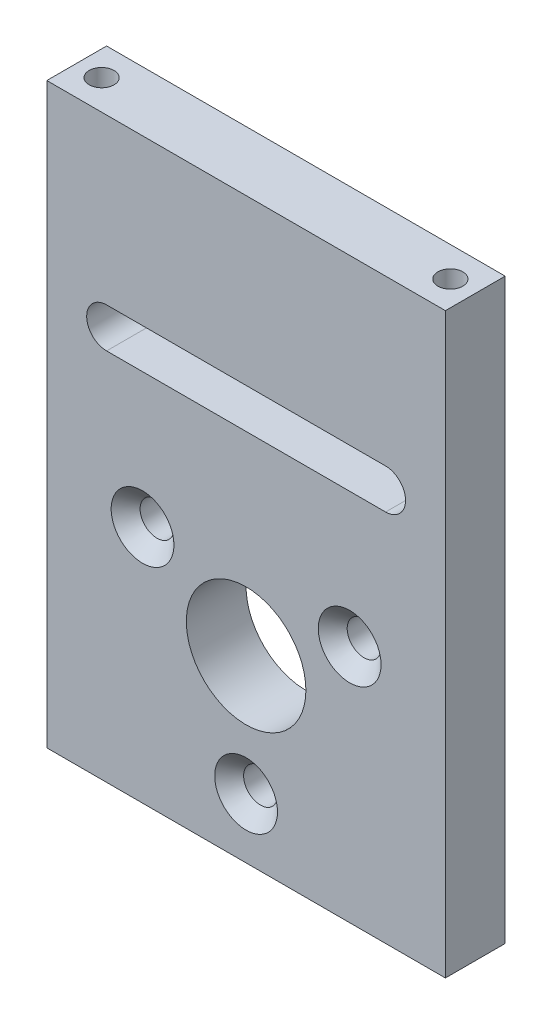
ISO-10303-21;
HEADER;
FILE_DESCRIPTION(('STEP AP214'),'2;1');
FILE_NAME('part.step','',(''),(''),'','','');
FILE_SCHEMA(('AUTOMOTIVE_DESIGN { 1 0 10303 214 1 1 1 1 }'));
ENDSEC;
DATA;
#1=APPLICATION_CONTEXT('core data for automotive mechanical design processes');
#2=APPLICATION_PROTOCOL_DEFINITION('international standard','automotive_design',2000,#1);
#3=PRODUCT_CONTEXT('',#1,'mechanical');
#4=PRODUCT('Part','Part','',(#3));
#5=PRODUCT_RELATED_PRODUCT_CATEGORY('part','',(#4));
#6=PRODUCT_DEFINITION_FORMATION('','',#4);
#7=PRODUCT_DEFINITION_CONTEXT('part definition',#1,'design');
#8=PRODUCT_DEFINITION('design','',#6,#7);
#9=PRODUCT_DEFINITION_SHAPE('','',#8);
#10=(LENGTH_UNIT() NAMED_UNIT(*) SI_UNIT(.MILLI.,.METRE.));
#11=(NAMED_UNIT(*) PLANE_ANGLE_UNIT() SI_UNIT($,.RADIAN.));
#12=(NAMED_UNIT(*) SI_UNIT($,.STERADIAN.) SOLID_ANGLE_UNIT());
#13=UNCERTAINTY_MEASURE_WITH_UNIT(LENGTH_MEASURE(1.E-05),#10,'distance_accuracy_value','');
#14=(GEOMETRIC_REPRESENTATION_CONTEXT(3) GLOBAL_UNCERTAINTY_ASSIGNED_CONTEXT((#13)) GLOBAL_UNIT_ASSIGNED_CONTEXT((#10,
#11,#12)) REPRESENTATION_CONTEXT('',''));
#15=CARTESIAN_POINT('',(0.,0.,0.));
#16=DIRECTION('',(0.,0.,1.));
#17=DIRECTION('',(1.,0.,0.));
#18=AXIS2_PLACEMENT_3D('',#15,#16,#17);
#19=CARTESIAN_POINT('',(20.,-29.,3.));
#20=DIRECTION('',(-1.,0.,0.));
#21=DIRECTION('',(0.,0.,1.));
#22=AXIS2_PLACEMENT_3D('',#19,#20,#21);
#23=PLANE('',#22);
#24=DIRECTION('',(0.,1.,0.));
#25=VECTOR('',#24,1.);
#26=CARTESIAN_POINT('',(20.,-29.,-3.));
#27=LINE('',#26,#25);
#28=CARTESIAN_POINT('',(20.,-29.,-3.));
#29=VERTEX_POINT('',#28);
#30=CARTESIAN_POINT('',(20.,29.,-3.));
#31=VERTEX_POINT('',#30);
#32=EDGE_CURVE('E243',#29,#31,#27,.T.);
#33=ORIENTED_EDGE('',*,*,#32,.T.);
#34=DIRECTION('',(0.,0.,-1.));
#35=VECTOR('',#34,1.);
#36=CARTESIAN_POINT('',(20.,29.,3.));
#37=LINE('',#36,#35);
#38=CARTESIAN_POINT('',(20.,29.,3.));
#39=VERTEX_POINT('',#38);
#40=EDGE_CURVE('E11',#39,#31,#37,.T.);
#41=ORIENTED_EDGE('',*,*,#40,.F.);
#42=DIRECTION('',(0.,1.,0.));
#43=VECTOR('',#42,1.);
#44=CARTESIAN_POINT('',(20.,-29.,3.));
#45=LINE('',#44,#43);
#46=CARTESIAN_POINT('',(20.,-29.,3.));
#47=VERTEX_POINT('',#46);
#48=EDGE_CURVE('E247',#47,#39,#45,.T.);
#49=ORIENTED_EDGE('',*,*,#48,.F.);
#50=DIRECTION('',(0.,0.,-1.));
#51=VECTOR('',#50,1.);
#52=CARTESIAN_POINT('',(20.,-29.,3.));
#53=LINE('',#52,#51);
#54=EDGE_CURVE('E261',#47,#29,#53,.T.);
#55=ORIENTED_EDGE('',*,*,#54,.T.);
#56=EDGE_LOOP('',(#33,#41,#49,#55));
#57=FACE_BOUND('',#56,.T.);
#58=ADVANCED_FACE('F44',(#57),#23,.F.);
#59=CARTESIAN_POINT('',(-20.,29.,3.));
#60=DIRECTION('',(0.,-1.,0.));
#61=DIRECTION('',(0.,0.,-1.));
#62=AXIS2_PLACEMENT_3D('',#59,#60,#61);
#63=PLANE('',#62);
#64=CARTESIAN_POINT('',(17.5,29.,0.));
#65=DIRECTION('',(0.,1.,0.));
#66=DIRECTION('',(0.,0.,1.));
#67=AXIS2_PLACEMENT_3D('',#64,#65,#66);
#68=CIRCLE('',#67,1.24999999999999);
#69=CARTESIAN_POINT('',(17.5,29.,1.24999999999999));
#70=VERTEX_POINT('',#69);
#71=EDGE_CURVE('E165',#70,#70,#68,.T.);
#72=ORIENTED_EDGE('',*,*,#71,.F.);
#73=EDGE_LOOP('',(#72));
#74=FACE_BOUND('',#73,.T.);
#75=CARTESIAN_POINT('',(-17.5,29.,0.));
#76=DIRECTION('',(0.,1.,0.));
#77=DIRECTION('',(0.,0.,1.));
#78=AXIS2_PLACEMENT_3D('',#75,#76,#77);
#79=CIRCLE('',#78,1.24999999999999);
#80=CARTESIAN_POINT('',(-17.5,29.,1.24999999999999));
#81=VERTEX_POINT('',#80);
#82=EDGE_CURVE('E178',#81,#81,#79,.T.);
#83=ORIENTED_EDGE('',*,*,#82,.F.);
#84=EDGE_LOOP('',(#83));
#85=FACE_BOUND('',#84,.T.);
#86=DIRECTION('',(-1.,0.,0.));
#87=VECTOR('',#86,1.);
#88=CARTESIAN_POINT('',(-20.,29.,-3.));
#89=LINE('',#88,#87);
#90=CARTESIAN_POINT('',(-20.,29.,-3.));
#91=VERTEX_POINT('',#90);
#92=EDGE_CURVE('E265',#31,#91,#89,.T.);
#93=ORIENTED_EDGE('',*,*,#92,.T.);
#94=DIRECTION('',(0.,0.,-1.));
#95=VECTOR('',#94,1.);
#96=CARTESIAN_POINT('',(-20.,29.,3.));
#97=LINE('',#96,#95);
#98=CARTESIAN_POINT('',(-20.,29.,3.));
#99=VERTEX_POINT('',#98);
#100=EDGE_CURVE('E52',#99,#91,#97,.T.);
#101=ORIENTED_EDGE('',*,*,#100,.F.);
#102=DIRECTION('',(-1.,0.,0.));
#103=VECTOR('',#102,1.);
#104=CARTESIAN_POINT('',(-20.,29.,3.));
#105=LINE('',#104,#103);
#106=EDGE_CURVE('E251',#39,#99,#105,.T.);
#107=ORIENTED_EDGE('',*,*,#106,.F.);
#108=ORIENTED_EDGE('',*,*,#40,.T.);
#109=EDGE_LOOP('',(#93,#101,#107,#108));
#110=FACE_BOUND('',#109,.T.);
#111=ADVANCED_FACE('F301',(#74,#85,#110),#63,.F.);
#112=CARTESIAN_POINT('',(-20.,-29.,3.));
#113=DIRECTION('',(1.,0.,0.));
#114=DIRECTION('',(0.,0.,-1.));
#115=AXIS2_PLACEMENT_3D('',#112,#113,#114);
#116=PLANE('',#115);
#117=DIRECTION('',(0.,-1.,0.));
#118=VECTOR('',#117,1.);
#119=CARTESIAN_POINT('',(-20.,-29.,-3.));
#120=LINE('',#119,#118);
#121=CARTESIAN_POINT('',(-20.,-29.,-3.));
#122=VERTEX_POINT('',#121);
#123=EDGE_CURVE('E268',#91,#122,#120,.T.);
#124=ORIENTED_EDGE('',*,*,#123,.T.);
#125=DIRECTION('',(0.,0.,-1.));
#126=VECTOR('',#125,1.);
#127=CARTESIAN_POINT('',(-20.,-29.,3.));
#128=LINE('',#127,#126);
#129=CARTESIAN_POINT('',(-20.,-29.,3.));
#130=VERTEX_POINT('',#129);
#131=EDGE_CURVE('E276',#130,#122,#128,.T.);
#132=ORIENTED_EDGE('',*,*,#131,.F.);
#133=DIRECTION('',(0.,-1.,0.));
#134=VECTOR('',#133,1.);
#135=CARTESIAN_POINT('',(-20.,-29.,3.));
#136=LINE('',#135,#134);
#137=EDGE_CURVE('E255',#99,#130,#136,.T.);
#138=ORIENTED_EDGE('',*,*,#137,.F.);
#139=ORIENTED_EDGE('',*,*,#100,.T.);
#140=EDGE_LOOP('',(#124,#132,#138,#139));
#141=FACE_BOUND('',#140,.T.);
#142=ADVANCED_FACE('F286',(#141),#116,.F.);
#143=CARTESIAN_POINT('',(-20.,-29.,3.));
#144=DIRECTION('',(0.,1.,0.));
#145=DIRECTION('',(0.,0.,1.));
#146=AXIS2_PLACEMENT_3D('',#143,#144,#145);
#147=PLANE('',#146);
#148=CARTESIAN_POINT('',(-10.75,-29.,0.));
#149=DIRECTION('',(0.,-1.,0.));
#150=DIRECTION('',(0.,0.,-1.));
#151=AXIS2_PLACEMENT_3D('',#148,#149,#150);
#152=CIRCLE('',#151,1.24999999999999);
#153=CARTESIAN_POINT('',(-10.75,-29.,-1.24999999999999));
#154=VERTEX_POINT('',#153);
#155=EDGE_CURVE('E186',#154,#154,#152,.T.);
#156=ORIENTED_EDGE('',*,*,#155,.F.);
#157=EDGE_LOOP('',(#156));
#158=FACE_BOUND('',#157,.T.);
#159=CARTESIAN_POINT('',(10.75,-29.,0.));
#160=DIRECTION('',(0.,-1.,0.));
#161=DIRECTION('',(0.,0.,-1.));
#162=AXIS2_PLACEMENT_3D('',#159,#160,#161);
#163=CIRCLE('',#162,1.24999999999999);
#164=CARTESIAN_POINT('',(10.75,-29.,-1.24999999999999));
#165=VERTEX_POINT('',#164);
#166=EDGE_CURVE('E194',#165,#165,#163,.T.);
#167=ORIENTED_EDGE('',*,*,#166,.F.);
#168=EDGE_LOOP('',(#167));
#169=FACE_BOUND('',#168,.T.);
#170=DIRECTION('',(1.,0.,0.));
#171=VECTOR('',#170,1.);
#172=CARTESIAN_POINT('',(-20.,-29.,-3.));
#173=LINE('',#172,#171);
#174=EDGE_CURVE('E252',#122,#29,#173,.T.);
#175=ORIENTED_EDGE('',*,*,#174,.T.);
#176=ORIENTED_EDGE('',*,*,#54,.F.);
#177=DIRECTION('',(1.,0.,0.));
#178=VECTOR('',#177,1.);
#179=CARTESIAN_POINT('',(-20.,-29.,3.));
#180=LINE('',#179,#178);
#181=EDGE_CURVE('E258',#130,#47,#180,.T.);
#182=ORIENTED_EDGE('',*,*,#181,.F.);
#183=ORIENTED_EDGE('',*,*,#131,.T.);
#184=EDGE_LOOP('',(#175,#176,#182,#183));
#185=FACE_BOUND('',#184,.T.);
#186=ADVANCED_FACE('F294',(#158,#169,#185),#147,.F.);
#187=CARTESIAN_POINT('',(0.,0.,3.));
#188=DIRECTION('',(0.,0.,-1.));
#189=DIRECTION('',(-1.,0.,0.));
#190=AXIS2_PLACEMENT_3D('',#187,#188,#189);
#191=PLANE('',#190);
#192=DIRECTION('',(1.,0.,0.));
#193=VECTOR('',#192,1.);
#194=CARTESIAN_POINT('',(-14.,8.5,3.));
#195=LINE('',#194,#193);
#196=CARTESIAN_POINT('',(-14.,8.5,3.));
#197=VERTEX_POINT('',#196);
#198=CARTESIAN_POINT('',(14.,8.5,3.));
#199=VERTEX_POINT('',#198);
#200=EDGE_CURVE('E156',#197,#199,#195,.T.);
#201=ORIENTED_EDGE('',*,*,#200,.F.);
#202=CARTESIAN_POINT('',(-14.,10.5,3.));
#203=DIRECTION('',(0.,0.,1.));
#204=DIRECTION('',(1.,0.,0.));
#205=AXIS2_PLACEMENT_3D('',#202,#203,#204);
#206=CIRCLE('',#205,2.);
#207=CARTESIAN_POINT('',(-14.,12.5,3.));
#208=VERTEX_POINT('',#207);
#209=EDGE_CURVE('E59',#208,#197,#206,.T.);
#210=ORIENTED_EDGE('',*,*,#209,.F.);
#211=DIRECTION('',(-1.,0.,0.));
#212=VECTOR('',#211,1.);
#213=CARTESIAN_POINT('',(-14.,12.5,3.));
#214=LINE('',#213,#212);
#215=CARTESIAN_POINT('',(14.,12.5,3.));
#216=VERTEX_POINT('',#215);
#217=EDGE_CURVE('E142',#216,#208,#214,.T.);
#218=ORIENTED_EDGE('',*,*,#217,.F.);
#219=CARTESIAN_POINT('',(14.,10.5,3.));
#220=DIRECTION('',(0.,0.,1.));
#221=DIRECTION('',(1.,0.,0.));
#222=AXIS2_PLACEMENT_3D('',#219,#220,#221);
#223=CIRCLE('',#222,2.);
#224=EDGE_CURVE('E147',#199,#216,#223,.T.);
#225=ORIENTED_EDGE('',*,*,#224,.F.);
#226=EDGE_LOOP('',(#201,#210,#218,#225));
#227=FACE_BOUND('',#226,.T.);
#228=CARTESIAN_POINT('',(0.,-23.,3.));
#229=DIRECTION('',(0.,0.,1.));
#230=DIRECTION('',(1.,0.,0.));
#231=AXIS2_PLACEMENT_3D('',#228,#229,#230);
#232=CIRCLE('',#231,3.15);
#233=CARTESIAN_POINT('',(3.15,-23.,3.));
#234=VERTEX_POINT('',#233);
#235=EDGE_CURVE('E202',#234,#234,#232,.T.);
#236=ORIENTED_EDGE('',*,*,#235,.F.);
#237=EDGE_LOOP('',(#236));
#238=FACE_BOUND('',#237,.T.);
#239=CARTESIAN_POINT('',(-10.3923048454133,-5.00000000000001,3.));
#240=DIRECTION('',(0.,0.,1.));
#241=DIRECTION('',(1.,0.,0.));
#242=AXIS2_PLACEMENT_3D('',#239,#240,#241);
#243=CIRCLE('',#242,3.15);
#244=CARTESIAN_POINT('',(-7.24230484541326,-5.00000000000001,3.));
#245=VERTEX_POINT('',#244);
#246=EDGE_CURVE('E214',#245,#245,#243,.T.);
#247=ORIENTED_EDGE('',*,*,#246,.F.);
#248=EDGE_LOOP('',(#247));
#249=FACE_BOUND('',#248,.T.);
#250=CARTESIAN_POINT('',(10.3923048454133,-5.00000000000001,3.));
#251=DIRECTION('',(0.,0.,1.));
#252=DIRECTION('',(1.,0.,0.));
#253=AXIS2_PLACEMENT_3D('',#250,#251,#252);
#254=CIRCLE('',#253,3.15);
#255=CARTESIAN_POINT('',(13.5423048454133,-5.00000000000001,3.));
#256=VERTEX_POINT('',#255);
#257=EDGE_CURVE('E226',#256,#256,#254,.T.);
#258=ORIENTED_EDGE('',*,*,#257,.F.);
#259=EDGE_LOOP('',(#258));
#260=FACE_BOUND('',#259,.T.);
#261=CARTESIAN_POINT('',(0.,-11.,3.));
#262=DIRECTION('',(0.,0.,1.));
#263=DIRECTION('',(1.,0.,0.));
#264=AXIS2_PLACEMENT_3D('',#261,#262,#263);
#265=CIRCLE('',#264,6.);
#266=CARTESIAN_POINT('',(6.,-11.,3.));
#267=VERTEX_POINT('',#266);
#268=EDGE_CURVE('E238',#267,#267,#265,.T.);
#269=ORIENTED_EDGE('',*,*,#268,.F.);
#270=EDGE_LOOP('',(#269));
#271=FACE_BOUND('',#270,.T.);
#272=ORIENTED_EDGE('',*,*,#48,.T.);
#273=ORIENTED_EDGE('',*,*,#106,.T.);
#274=ORIENTED_EDGE('',*,*,#137,.T.);
#275=ORIENTED_EDGE('',*,*,#181,.T.);
#276=EDGE_LOOP('',(#272,#273,#274,#275));
#277=FACE_BOUND('',#276,.T.);
#278=ADVANCED_FACE('F300',(#227,#238,#249,#260,#271,#277),#191,.F.);
#279=CARTESIAN_POINT('',(0.,0.,-3.));
#280=DIRECTION('',(0.,0.,-1.));
#281=DIRECTION('',(-1.,0.,0.));
#282=AXIS2_PLACEMENT_3D('',#279,#280,#281);
#283=PLANE('',#282);
#284=CARTESIAN_POINT('',(-14.,10.5,-3.));
#285=DIRECTION('',(0.,0.,1.));
#286=DIRECTION('',(1.,0.,0.));
#287=AXIS2_PLACEMENT_3D('',#284,#285,#286);
#288=CIRCLE('',#287,2.);
#289=CARTESIAN_POINT('',(-14.,12.5,-3.));
#290=VERTEX_POINT('',#289);
#291=CARTESIAN_POINT('',(-14.,8.5,-3.));
#292=VERTEX_POINT('',#291);
#293=EDGE_CURVE('E123',#290,#292,#288,.T.);
#294=ORIENTED_EDGE('',*,*,#293,.T.);
#295=DIRECTION('',(1.,0.,0.));
#296=VECTOR('',#295,1.);
#297=CARTESIAN_POINT('',(-14.,8.5,-3.));
#298=LINE('',#297,#296);
#299=CARTESIAN_POINT('',(14.,8.5,-3.));
#300=VERTEX_POINT('',#299);
#301=EDGE_CURVE('E133',#292,#300,#298,.T.);
#302=ORIENTED_EDGE('',*,*,#301,.T.);
#303=CARTESIAN_POINT('',(14.,10.5,-3.));
#304=DIRECTION('',(0.,0.,1.));
#305=DIRECTION('',(1.,0.,0.));
#306=AXIS2_PLACEMENT_3D('',#303,#304,#305);
#307=CIRCLE('',#306,2.);
#308=CARTESIAN_POINT('',(14.,12.5,-3.));
#309=VERTEX_POINT('',#308);
#310=EDGE_CURVE('E67',#300,#309,#307,.T.);
#311=ORIENTED_EDGE('',*,*,#310,.T.);
#312=DIRECTION('',(-1.,0.,0.));
#313=VECTOR('',#312,1.);
#314=CARTESIAN_POINT('',(-14.,12.5,-3.));
#315=LINE('',#314,#313);
#316=EDGE_CURVE('E130',#309,#290,#315,.T.);
#317=ORIENTED_EDGE('',*,*,#316,.T.);
#318=EDGE_LOOP('',(#294,#302,#311,#317));
#319=FACE_BOUND('',#318,.T.);
#320=CARTESIAN_POINT('',(0.,-23.,-3.));
#321=DIRECTION('',(0.,0.,1.));
#322=DIRECTION('',(1.,0.,0.));
#323=AXIS2_PLACEMENT_3D('',#320,#321,#322);
#324=CIRCLE('',#323,1.7);
#325=CARTESIAN_POINT('',(1.7,-23.,-3.));
#326=VERTEX_POINT('',#325);
#327=EDGE_CURVE('E210',#326,#326,#324,.T.);
#328=ORIENTED_EDGE('',*,*,#327,.T.);
#329=EDGE_LOOP('',(#328));
#330=FACE_BOUND('',#329,.T.);
#331=CARTESIAN_POINT('',(-10.3923048454133,-5.00000000000001,-3.));
#332=DIRECTION('',(0.,0.,1.));
#333=DIRECTION('',(1.,0.,0.));
#334=AXIS2_PLACEMENT_3D('',#331,#332,#333);
#335=CIRCLE('',#334,1.7);
#336=CARTESIAN_POINT('',(-8.69230484541326,-5.00000000000001,-3.));
#337=VERTEX_POINT('',#336);
#338=EDGE_CURVE('E222',#337,#337,#335,.T.);
#339=ORIENTED_EDGE('',*,*,#338,.T.);
#340=EDGE_LOOP('',(#339));
#341=FACE_BOUND('',#340,.T.);
#342=CARTESIAN_POINT('',(10.3923048454133,-5.00000000000001,-3.));
#343=DIRECTION('',(0.,0.,1.));
#344=DIRECTION('',(1.,0.,0.));
#345=AXIS2_PLACEMENT_3D('',#342,#343,#344);
#346=CIRCLE('',#345,1.7);
#347=CARTESIAN_POINT('',(12.0923048454133,-5.00000000000001,-3.));
#348=VERTEX_POINT('',#347);
#349=EDGE_CURVE('E234',#348,#348,#346,.T.);
#350=ORIENTED_EDGE('',*,*,#349,.T.);
#351=EDGE_LOOP('',(#350));
#352=FACE_BOUND('',#351,.T.);
#353=CARTESIAN_POINT('',(0.,-11.,-3.));
#354=DIRECTION('',(0.,0.,1.));
#355=DIRECTION('',(1.,0.,0.));
#356=AXIS2_PLACEMENT_3D('',#353,#354,#355);
#357=CIRCLE('',#356,6.);
#358=CARTESIAN_POINT('',(6.,-11.,-3.));
#359=VERTEX_POINT('',#358);
#360=EDGE_CURVE('E239',#359,#359,#357,.T.);
#361=ORIENTED_EDGE('',*,*,#360,.T.);
#362=EDGE_LOOP('',(#361));
#363=FACE_BOUND('',#362,.T.);
#364=ORIENTED_EDGE('',*,*,#32,.F.);
#365=ORIENTED_EDGE('',*,*,#174,.F.);
#366=ORIENTED_EDGE('',*,*,#123,.F.);
#367=ORIENTED_EDGE('',*,*,#92,.F.);
#368=EDGE_LOOP('',(#364,#365,#366,#367));
#369=FACE_BOUND('',#368,.T.);
#370=ADVANCED_FACE('F138',(#319,#330,#341,#352,#363,#369),#283,.T.);
#371=CARTESIAN_POINT('',(0.,-11.,-3.));
#372=DIRECTION('',(0.,0.,1.));
#373=DIRECTION('',(1.,0.,0.));
#374=AXIS2_PLACEMENT_3D('',#371,#372,#373);
#375=CYLINDRICAL_SURFACE('',#374,6.);
#376=ORIENTED_EDGE('',*,*,#360,.F.);
#377=EDGE_LOOP('',(#376));
#378=FACE_BOUND('',#377,.T.);
#379=ORIENTED_EDGE('',*,*,#268,.T.);
#380=EDGE_LOOP('',(#379));
#381=FACE_BOUND('',#380,.T.);
#382=ADVANCED_FACE('F317',(#378,#381),#375,.F.);
#383=CARTESIAN_POINT('',(10.3923048454133,-5.00000000000001,3.));
#384=DIRECTION('',(0.,0.,1.));
#385=DIRECTION('',(1.,0.,0.));
#386=AXIS2_PLACEMENT_3D('',#383,#384,#385);
#387=CYLINDRICAL_SURFACE('',#386,1.7);
#388=ORIENTED_EDGE('',*,*,#349,.F.);
#389=EDGE_LOOP('',(#388));
#390=FACE_BOUND('',#389,.T.);
#391=CARTESIAN_POINT('',(10.3923048454133,-5.00000000000001,1.55));
#392=DIRECTION('',(0.,0.,1.));
#393=DIRECTION('',(1.,0.,0.));
#394=AXIS2_PLACEMENT_3D('',#391,#392,#393);
#395=CIRCLE('',#394,1.7);
#396=CARTESIAN_POINT('',(12.0923048454133,-5.00000000000001,1.55));
#397=VERTEX_POINT('',#396);
#398=EDGE_CURVE('E230',#397,#397,#395,.T.);
#399=ORIENTED_EDGE('',*,*,#398,.T.);
#400=EDGE_LOOP('',(#399));
#401=FACE_BOUND('',#400,.T.);
#402=ADVANCED_FACE('F323',(#390,#401),#387,.F.);
#403=CARTESIAN_POINT('',(10.3923048454133,-5.00000000000001,3.));
#404=DIRECTION('',(0.,0.,1.));
#405=DIRECTION('',(1.,0.,0.));
#406=AXIS2_PLACEMENT_3D('',#403,#404,#405);
#407=CONICAL_SURFACE('',#406,3.15,0.785398163397448);
#408=ORIENTED_EDGE('',*,*,#398,.F.);
#409=EDGE_LOOP('',(#408));
#410=FACE_BOUND('',#409,.T.);
#411=ORIENTED_EDGE('',*,*,#257,.T.);
#412=EDGE_LOOP('',(#411));
#413=FACE_BOUND('',#412,.T.);
#414=ADVANCED_FACE('F327',(#410,#413),#407,.F.);
#415=CARTESIAN_POINT('',(-10.3923048454133,-5.00000000000001,3.));
#416=DIRECTION('',(0.,0.,1.));
#417=DIRECTION('',(1.,0.,0.));
#418=AXIS2_PLACEMENT_3D('',#415,#416,#417);
#419=CYLINDRICAL_SURFACE('',#418,1.7);
#420=ORIENTED_EDGE('',*,*,#338,.F.);
#421=EDGE_LOOP('',(#420));
#422=FACE_BOUND('',#421,.T.);
#423=CARTESIAN_POINT('',(-10.3923048454133,-5.00000000000001,1.55));
#424=DIRECTION('',(0.,0.,1.));
#425=DIRECTION('',(1.,0.,0.));
#426=AXIS2_PLACEMENT_3D('',#423,#424,#425);
#427=CIRCLE('',#426,1.7);
#428=CARTESIAN_POINT('',(-8.69230484541326,-5.00000000000001,1.55));
#429=VERTEX_POINT('',#428);
#430=EDGE_CURVE('E218',#429,#429,#427,.T.);
#431=ORIENTED_EDGE('',*,*,#430,.T.);
#432=EDGE_LOOP('',(#431));
#433=FACE_BOUND('',#432,.T.);
#434=ADVANCED_FACE('F331',(#422,#433),#419,.F.);
#435=CARTESIAN_POINT('',(-10.3923048454133,-5.00000000000001,3.));
#436=DIRECTION('',(0.,0.,1.));
#437=DIRECTION('',(1.,0.,0.));
#438=AXIS2_PLACEMENT_3D('',#435,#436,#437);
#439=CONICAL_SURFACE('',#438,3.15,0.785398163397448);
#440=ORIENTED_EDGE('',*,*,#430,.F.);
#441=EDGE_LOOP('',(#440));
#442=FACE_BOUND('',#441,.T.);
#443=ORIENTED_EDGE('',*,*,#246,.T.);
#444=EDGE_LOOP('',(#443));
#445=FACE_BOUND('',#444,.T.);
#446=ADVANCED_FACE('F335',(#442,#445),#439,.F.);
#447=CARTESIAN_POINT('',(0.,-23.,3.));
#448=DIRECTION('',(0.,0.,1.));
#449=DIRECTION('',(1.,0.,0.));
#450=AXIS2_PLACEMENT_3D('',#447,#448,#449);
#451=CYLINDRICAL_SURFACE('',#450,1.7);
#452=ORIENTED_EDGE('',*,*,#327,.F.);
#453=EDGE_LOOP('',(#452));
#454=FACE_BOUND('',#453,.T.);
#455=CARTESIAN_POINT('',(0.,-23.,1.55));
#456=DIRECTION('',(0.,0.,1.));
#457=DIRECTION('',(1.,0.,0.));
#458=AXIS2_PLACEMENT_3D('',#455,#456,#457);
#459=CIRCLE('',#458,1.7);
#460=CARTESIAN_POINT('',(1.7,-23.,1.55));
#461=VERTEX_POINT('',#460);
#462=EDGE_CURVE('E206',#461,#461,#459,.T.);
#463=ORIENTED_EDGE('',*,*,#462,.T.);
#464=EDGE_LOOP('',(#463));
#465=FACE_BOUND('',#464,.T.);
#466=ADVANCED_FACE('F339',(#454,#465),#451,.F.);
#467=CARTESIAN_POINT('',(0.,-23.,3.));
#468=DIRECTION('',(0.,0.,1.));
#469=DIRECTION('',(1.,0.,0.));
#470=AXIS2_PLACEMENT_3D('',#467,#468,#469);
#471=CONICAL_SURFACE('',#470,3.15,0.785398163397448);
#472=ORIENTED_EDGE('',*,*,#462,.F.);
#473=EDGE_LOOP('',(#472));
#474=FACE_BOUND('',#473,.T.);
#475=ORIENTED_EDGE('',*,*,#235,.T.);
#476=EDGE_LOOP('',(#475));
#477=FACE_BOUND('',#476,.T.);
#478=ADVANCED_FACE('F343',(#474,#477),#471,.F.);
#479=CARTESIAN_POINT('',(10.75,-20.,0.));
#480=DIRECTION('',(0.,-1.,0.));
#481=DIRECTION('',(0.,0.,-1.));
#482=AXIS2_PLACEMENT_3D('',#479,#480,#481);
#483=CONICAL_SURFACE('',#482,1.24999999999999,1.02974425867665);
#484=CARTESIAN_POINT('',(10.75,-19.2489242262156,0.));
#485=VERTEX_POINT('',#484);
#486=VERTEX_LOOP('',#485);
#487=FACE_BOUND('',#486,.T.);
#488=CARTESIAN_POINT('',(10.75,-20.,0.));
#489=DIRECTION('',(0.,-1.,0.));
#490=DIRECTION('',(0.,0.,-1.));
#491=AXIS2_PLACEMENT_3D('',#488,#489,#490);
#492=CIRCLE('',#491,1.24999999999999);
#493=CARTESIAN_POINT('',(10.75,-20.,-1.24999999999999));
#494=VERTEX_POINT('',#493);
#495=EDGE_CURVE('E198',#494,#494,#492,.T.);
#496=ORIENTED_EDGE('',*,*,#495,.T.);
#497=EDGE_LOOP('',(#496));
#498=FACE_BOUND('',#497,.T.);
#499=ADVANCED_FACE('F347',(#487,#498),#483,.F.);
#500=CARTESIAN_POINT('',(10.75,-29.,0.));
#501=DIRECTION('',(0.,-1.,0.));
#502=DIRECTION('',(0.,0.,-1.));
#503=AXIS2_PLACEMENT_3D('',#500,#501,#502);
#504=CYLINDRICAL_SURFACE('',#503,1.24999999999999);
#505=ORIENTED_EDGE('',*,*,#495,.F.);
#506=EDGE_LOOP('',(#505));
#507=FACE_BOUND('',#506,.T.);
#508=ORIENTED_EDGE('',*,*,#166,.T.);
#509=EDGE_LOOP('',(#508));
#510=FACE_BOUND('',#509,.T.);
#511=ADVANCED_FACE('F351',(#507,#510),#504,.F.);
#512=CARTESIAN_POINT('',(-10.75,-20.,0.));
#513=DIRECTION('',(0.,-1.,0.));
#514=DIRECTION('',(0.,0.,-1.));
#515=AXIS2_PLACEMENT_3D('',#512,#513,#514);
#516=CONICAL_SURFACE('',#515,1.24999999999999,1.02974425867665);
#517=CARTESIAN_POINT('',(-10.75,-19.2489242262156,0.));
#518=VERTEX_POINT('',#517);
#519=VERTEX_LOOP('',#518);
#520=FACE_BOUND('',#519,.T.);
#521=CARTESIAN_POINT('',(-10.75,-20.,0.));
#522=DIRECTION('',(0.,-1.,0.));
#523=DIRECTION('',(0.,0.,-1.));
#524=AXIS2_PLACEMENT_3D('',#521,#522,#523);
#525=CIRCLE('',#524,1.24999999999999);
#526=CARTESIAN_POINT('',(-10.75,-20.,-1.24999999999999));
#527=VERTEX_POINT('',#526);
#528=EDGE_CURVE('E190',#527,#527,#525,.T.);
#529=ORIENTED_EDGE('',*,*,#528,.T.);
#530=EDGE_LOOP('',(#529));
#531=FACE_BOUND('',#530,.T.);
#532=ADVANCED_FACE('F355',(#520,#531),#516,.F.);
#533=CARTESIAN_POINT('',(-10.75,-29.,0.));
#534=DIRECTION('',(0.,-1.,0.));
#535=DIRECTION('',(0.,0.,-1.));
#536=AXIS2_PLACEMENT_3D('',#533,#534,#535);
#537=CYLINDRICAL_SURFACE('',#536,1.24999999999999);
#538=ORIENTED_EDGE('',*,*,#528,.F.);
#539=EDGE_LOOP('',(#538));
#540=FACE_BOUND('',#539,.T.);
#541=ORIENTED_EDGE('',*,*,#155,.T.);
#542=EDGE_LOOP('',(#541));
#543=FACE_BOUND('',#542,.T.);
#544=ADVANCED_FACE('F359',(#540,#543),#537,.F.);
#545=CARTESIAN_POINT('',(-17.5,20.,0.));
#546=DIRECTION('',(0.,1.,0.));
#547=DIRECTION('',(0.,0.,1.));
#548=AXIS2_PLACEMENT_3D('',#545,#546,#547);
#549=CONICAL_SURFACE('',#548,1.24999999999999,1.02974425867664);
#550=CARTESIAN_POINT('',(-17.5,19.2489242262155,0.));
#551=VERTEX_POINT('',#550);
#552=VERTEX_LOOP('',#551);
#553=FACE_BOUND('',#552,.T.);
#554=CARTESIAN_POINT('',(-17.5,20.,0.));
#555=DIRECTION('',(0.,1.,0.));
#556=DIRECTION('',(0.,0.,1.));
#557=AXIS2_PLACEMENT_3D('',#554,#555,#556);
#558=CIRCLE('',#557,1.24999999999999);
#559=CARTESIAN_POINT('',(-17.5,20.,1.24999999999999));
#560=VERTEX_POINT('',#559);
#561=EDGE_CURVE('E182',#560,#560,#558,.T.);
#562=ORIENTED_EDGE('',*,*,#561,.T.);
#563=EDGE_LOOP('',(#562));
#564=FACE_BOUND('',#563,.T.);
#565=ADVANCED_FACE('F363',(#553,#564),#549,.F.);
#566=CARTESIAN_POINT('',(-17.5,29.,0.));
#567=DIRECTION('',(0.,1.,0.));
#568=DIRECTION('',(0.,0.,1.));
#569=AXIS2_PLACEMENT_3D('',#566,#567,#568);
#570=CYLINDRICAL_SURFACE('',#569,1.24999999999999);
#571=ORIENTED_EDGE('',*,*,#561,.F.);
#572=EDGE_LOOP('',(#571));
#573=FACE_BOUND('',#572,.T.);
#574=ORIENTED_EDGE('',*,*,#82,.T.);
#575=EDGE_LOOP('',(#574));
#576=FACE_BOUND('',#575,.T.);
#577=ADVANCED_FACE('F367',(#573,#576),#570,.F.);
#578=CARTESIAN_POINT('',(17.5,20.,0.));
#579=DIRECTION('',(0.,1.,0.));
#580=DIRECTION('',(0.,0.,1.));
#581=AXIS2_PLACEMENT_3D('',#578,#579,#580);
#582=CONICAL_SURFACE('',#581,1.24999999999999,1.02974425867664);
#583=CARTESIAN_POINT('',(17.5,19.2489242262155,0.));
#584=VERTEX_POINT('',#583);
#585=VERTEX_LOOP('',#584);
#586=FACE_BOUND('',#585,.T.);
#587=CARTESIAN_POINT('',(17.5,20.,0.));
#588=DIRECTION('',(0.,1.,0.));
#589=DIRECTION('',(0.,0.,1.));
#590=AXIS2_PLACEMENT_3D('',#587,#588,#589);
#591=CIRCLE('',#590,1.24999999999999);
#592=CARTESIAN_POINT('',(17.5,20.,1.24999999999999));
#593=VERTEX_POINT('',#592);
#594=EDGE_CURVE('E174',#593,#593,#591,.T.);
#595=ORIENTED_EDGE('',*,*,#594,.T.);
#596=EDGE_LOOP('',(#595));
#597=FACE_BOUND('',#596,.T.);
#598=ADVANCED_FACE('F371',(#586,#597),#582,.F.);
#599=CARTESIAN_POINT('',(17.5,29.,0.));
#600=DIRECTION('',(0.,1.,0.));
#601=DIRECTION('',(0.,0.,1.));
#602=AXIS2_PLACEMENT_3D('',#599,#600,#601);
#603=CYLINDRICAL_SURFACE('',#602,1.24999999999999);
#604=ORIENTED_EDGE('',*,*,#594,.F.);
#605=EDGE_LOOP('',(#604));
#606=FACE_BOUND('',#605,.T.);
#607=ORIENTED_EDGE('',*,*,#71,.T.);
#608=EDGE_LOOP('',(#607));
#609=FACE_BOUND('',#608,.T.);
#610=ADVANCED_FACE('F375',(#606,#609),#603,.F.);
#611=CARTESIAN_POINT('',(-14.,10.5,-3.));
#612=DIRECTION('',(0.,0.,1.));
#613=DIRECTION('',(1.,0.,0.));
#614=AXIS2_PLACEMENT_3D('',#611,#612,#613);
#615=CYLINDRICAL_SURFACE('',#614,2.);
#616=ORIENTED_EDGE('',*,*,#209,.T.);
#617=DIRECTION('',(0.,0.,1.));
#618=VECTOR('',#617,1.);
#619=CARTESIAN_POINT('',(-14.,8.5,-3.));
#620=LINE('',#619,#618);
#621=EDGE_CURVE('E119',#292,#197,#620,.T.);
#622=ORIENTED_EDGE('',*,*,#621,.F.);
#623=ORIENTED_EDGE('',*,*,#293,.F.);
#624=DIRECTION('',(0.,0.,1.));
#625=VECTOR('',#624,1.);
#626=CARTESIAN_POINT('',(-14.,12.5,-3.));
#627=LINE('',#626,#625);
#628=EDGE_CURVE('E162',#290,#208,#627,.T.);
#629=ORIENTED_EDGE('',*,*,#628,.T.);
#630=EDGE_LOOP('',(#616,#622,#623,#629));
#631=FACE_BOUND('',#630,.T.);
#632=ADVANCED_FACE('F121',(#631),#615,.F.);
#633=CARTESIAN_POINT('',(-14.,12.5,-3.));
#634=DIRECTION('',(0.,1.,0.));
#635=DIRECTION('',(0.,0.,1.));
#636=AXIS2_PLACEMENT_3D('',#633,#634,#635);
#637=PLANE('',#636);
#638=ORIENTED_EDGE('',*,*,#217,.T.);
#639=ORIENTED_EDGE('',*,*,#628,.F.);
#640=ORIENTED_EDGE('',*,*,#316,.F.);
#641=DIRECTION('',(0.,0.,1.));
#642=VECTOR('',#641,1.);
#643=CARTESIAN_POINT('',(14.,12.5,-3.));
#644=LINE('',#643,#642);
#645=EDGE_CURVE('E166',#309,#216,#644,.T.);
#646=ORIENTED_EDGE('',*,*,#645,.T.);
#647=EDGE_LOOP('',(#638,#639,#640,#646));
#648=FACE_BOUND('',#647,.T.);
#649=ADVANCED_FACE('F382',(#648),#637,.F.);
#650=CARTESIAN_POINT('',(14.,10.5,-3.));
#651=DIRECTION('',(0.,0.,1.));
#652=DIRECTION('',(1.,0.,0.));
#653=AXIS2_PLACEMENT_3D('',#650,#651,#652);
#654=CYLINDRICAL_SURFACE('',#653,2.);
#655=ORIENTED_EDGE('',*,*,#224,.T.);
#656=ORIENTED_EDGE('',*,*,#645,.F.);
#657=ORIENTED_EDGE('',*,*,#310,.F.);
#658=DIRECTION('',(0.,0.,1.));
#659=VECTOR('',#658,1.);
#660=CARTESIAN_POINT('',(14.,8.5,-3.));
#661=LINE('',#660,#659);
#662=EDGE_CURVE('E129',#300,#199,#661,.T.);
#663=ORIENTED_EDGE('',*,*,#662,.T.);
#664=EDGE_LOOP('',(#655,#656,#657,#663));
#665=FACE_BOUND('',#664,.T.);
#666=ADVANCED_FACE('F385',(#665),#654,.F.);
#667=CARTESIAN_POINT('',(-14.,8.5,-3.));
#668=DIRECTION('',(0.,-1.,0.));
#669=DIRECTION('',(0.,0.,-1.));
#670=AXIS2_PLACEMENT_3D('',#667,#668,#669);
#671=PLANE('',#670);
#672=ORIENTED_EDGE('',*,*,#200,.T.);
#673=ORIENTED_EDGE('',*,*,#662,.F.);
#674=ORIENTED_EDGE('',*,*,#301,.F.);
#675=ORIENTED_EDGE('',*,*,#621,.T.);
#676=EDGE_LOOP('',(#672,#673,#674,#675));
#677=FACE_BOUND('',#676,.T.);
#678=ADVANCED_FACE('F134',(#677),#671,.F.);
#679=CLOSED_SHELL('',(#58,#111,#142,#186,#278,#370,#382,#402,#414,#434,#446,#466,#478,#499,#511,
#532,#544,#565,#577,#598,#610,#632,#649,#666,#678));
#680=MANIFOLD_SOLID_BREP('B2',#679);
#681=ADVANCED_BREP_SHAPE_REPRESENTATION('',(#18,#680),#14);
#682=SHAPE_DEFINITION_REPRESENTATION(#9,#681);
ENDSEC;
END-ISO-10303-21;
